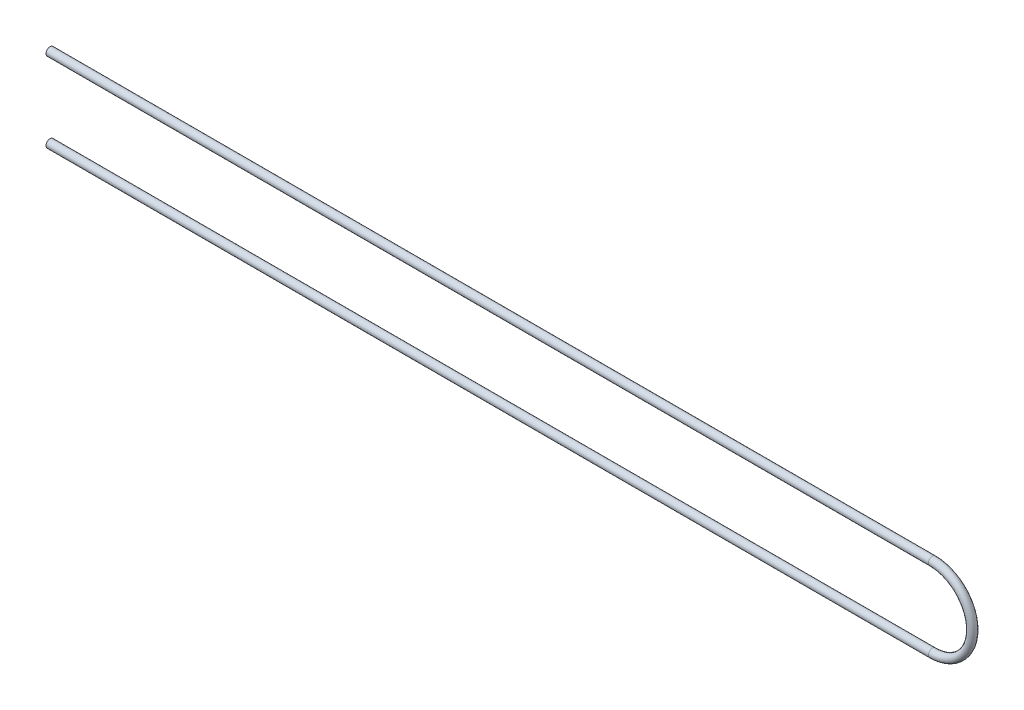
ISO-10303-21;
HEADER;
FILE_DESCRIPTION(('STEP AP214'),'2;1');
FILE_NAME('part.step','',(''),(''),'','','');
FILE_SCHEMA(('AUTOMOTIVE_DESIGN { 1 0 10303 214 1 1 1 1 }'));
ENDSEC;
DATA;
#1=APPLICATION_CONTEXT('core data for automotive mechanical design processes');
#2=APPLICATION_PROTOCOL_DEFINITION('international standard','automotive_design',2000,#1);
#3=PRODUCT_CONTEXT('',#1,'mechanical');
#4=PRODUCT('Part','Part','',(#3));
#5=PRODUCT_RELATED_PRODUCT_CATEGORY('part','',(#4));
#6=PRODUCT_DEFINITION_FORMATION('','',#4);
#7=PRODUCT_DEFINITION_CONTEXT('part definition',#1,'design');
#8=PRODUCT_DEFINITION('design','',#6,#7);
#9=PRODUCT_DEFINITION_SHAPE('','',#8);
#10=(LENGTH_UNIT() NAMED_UNIT(*) SI_UNIT(.MILLI.,.METRE.));
#11=(NAMED_UNIT(*) PLANE_ANGLE_UNIT() SI_UNIT($,.RADIAN.));
#12=(NAMED_UNIT(*) SI_UNIT($,.STERADIAN.) SOLID_ANGLE_UNIT());
#13=UNCERTAINTY_MEASURE_WITH_UNIT(LENGTH_MEASURE(1.E-05),#10,'distance_accuracy_value','');
#14=(GEOMETRIC_REPRESENTATION_CONTEXT(3) GLOBAL_UNCERTAINTY_ASSIGNED_CONTEXT((#13)) GLOBAL_UNIT_ASSIGNED_CONTEXT((#10,
#11,#12)) REPRESENTATION_CONTEXT('',''));
#15=CARTESIAN_POINT('',(0.,0.,0.));
#16=DIRECTION('',(0.,0.,1.));
#17=DIRECTION('',(1.,0.,0.));
#18=AXIS2_PLACEMENT_3D('',#15,#16,#17);
#19=CARTESIAN_POINT('',(0.,0.,0.));
#20=DIRECTION('',(-1.,0.,0.));
#21=DIRECTION('',(0.,-1.,0.));
#22=AXIS2_PLACEMENT_3D('',#19,#20,#21);
#23=PLANE('',#22);
#24=CARTESIAN_POINT('',(0.,0.,0.));
#25=DIRECTION('',(-1.,0.,0.));
#26=DIRECTION('',(0.,-1.,0.));
#27=AXIS2_PLACEMENT_3D('',#24,#25,#26);
#28=CIRCLE('',#27,10.15);
#29=CARTESIAN_POINT('',(0.,-10.15,0.));
#30=VERTEX_POINT('',#29);
#31=EDGE_CURVE('E72',#30,#30,#28,.T.);
#32=ORIENTED_EDGE('',*,*,#31,.F.);
#33=EDGE_LOOP('',(#32));
#34=FACE_BOUND('',#33,.T.);
#35=CARTESIAN_POINT('',(0.,0.,0.));
#36=DIRECTION('',(-1.,0.,0.));
#37=DIRECTION('',(0.,-1.,0.));
#38=AXIS2_PLACEMENT_3D('',#35,#36,#37);
#39=CIRCLE('',#38,10.65);
#40=CARTESIAN_POINT('',(0.,-10.65,0.));
#41=VERTEX_POINT('',#40);
#42=EDGE_CURVE('E63',#41,#41,#39,.T.);
#43=ORIENTED_EDGE('',*,*,#42,.T.);
#44=EDGE_LOOP('',(#43));
#45=FACE_BOUND('',#44,.T.);
#46=ADVANCED_FACE('F49',(#34,#45),#23,.T.);
#47=CARTESIAN_POINT('',(0.,-210.,0.));
#48=DIRECTION('',(1.,0.,0.));
#49=DIRECTION('',(0.,1.,0.));
#50=AXIS2_PLACEMENT_3D('',#47,#48,#49);
#51=PLANE('',#50);
#52=CARTESIAN_POINT('',(0.,-210.,0.));
#53=DIRECTION('',(1.,0.,0.));
#54=DIRECTION('',(0.,1.,0.));
#55=AXIS2_PLACEMENT_3D('',#52,#53,#54);
#56=CIRCLE('',#55,10.15);
#57=CARTESIAN_POINT('',(0.,-199.85,0.));
#58=VERTEX_POINT('',#57);
#59=EDGE_CURVE('E68',#58,#58,#56,.T.);
#60=ORIENTED_EDGE('',*,*,#59,.T.);
#61=EDGE_LOOP('',(#60));
#62=FACE_BOUND('',#61,.T.);
#63=CARTESIAN_POINT('',(0.,-210.,0.));
#64=DIRECTION('',(1.,0.,0.));
#65=DIRECTION('',(0.,1.,0.));
#66=AXIS2_PLACEMENT_3D('',#63,#64,#65);
#67=CIRCLE('',#66,10.65);
#68=CARTESIAN_POINT('',(0.,-199.35,0.));
#69=VERTEX_POINT('',#68);
#70=EDGE_CURVE('E11',#69,#69,#67,.T.);
#71=ORIENTED_EDGE('',*,*,#70,.F.);
#72=EDGE_LOOP('',(#71));
#73=FACE_BOUND('',#72,.T.);
#74=ADVANCED_FACE('F92',(#62,#73),#51,.F.);
#75=CARTESIAN_POINT('',(0.,0.,0.));
#76=DIRECTION('',(1.,0.,0.));
#77=DIRECTION('',(0.,0.,-1.));
#78=AXIS2_PLACEMENT_3D('',#75,#76,#77);
#79=CYLINDRICAL_SURFACE('',#78,10.65);
#80=CARTESIAN_POINT('',(2325.,0.,0.));
#81=DIRECTION('',(-1.,0.,0.));
#82=DIRECTION('',(0.,-1.,0.));
#83=AXIS2_PLACEMENT_3D('',#80,#81,#82);
#84=CIRCLE('',#83,10.65);
#85=CARTESIAN_POINT('',(2325.,10.65,0.));
#86=VERTEX_POINT('',#85);
#87=EDGE_CURVE('E59',#86,#86,#84,.T.);
#88=ORIENTED_EDGE('',*,*,#87,.T.);
#89=EDGE_LOOP('',(#88));
#90=FACE_BOUND('',#89,.T.);
#91=ORIENTED_EDGE('',*,*,#42,.F.);
#92=EDGE_LOOP('',(#91));
#93=FACE_BOUND('',#92,.T.);
#94=ADVANCED_FACE('F96',(#90,#93),#79,.T.);
#95=CARTESIAN_POINT('',(2325.,-105.,0.));
#96=DIRECTION('',(0.,0.,-1.));
#97=DIRECTION('',(-1.,0.,0.));
#98=AXIS2_PLACEMENT_3D('',#95,#96,#97);
#99=TOROIDAL_SURFACE('',#98,105.,10.65);
#100=CARTESIAN_POINT('',(2325.,-210.,0.));
#101=DIRECTION('',(1.,0.,0.));
#102=DIRECTION('',(0.,1.,0.));
#103=AXIS2_PLACEMENT_3D('',#100,#101,#102);
#104=CIRCLE('',#103,10.65);
#105=CARTESIAN_POINT('',(2325.,-220.65,0.));
#106=VERTEX_POINT('',#105);
#107=EDGE_CURVE('E55',#106,#106,#104,.T.);
#108=CARTESIAN_POINT('',(2325.,-105.,0.));
#109=DIRECTION('',(0.,0.,-1.));
#110=DIRECTION('',(-1.,0.,0.));
#111=AXIS2_PLACEMENT_3D('',#108,#109,#110);
#112=CIRCLE('',#111,115.65);
#113=EDGE_CURVE('',#86,#106,#112,.T.);
#114=ORIENTED_EDGE('',*,*,#87,.F.);
#115=ORIENTED_EDGE('',*,*,#107,.T.);
#116=ORIENTED_EDGE('',*,*,#113,.T.);
#117=ORIENTED_EDGE('',*,*,#113,.F.);
#118=EDGE_LOOP('',(#114,#116,#115,#117));
#119=FACE_BOUND('',#118,.T.);
#120=ADVANCED_FACE('F98',(#119),#99,.T.);
#121=CARTESIAN_POINT('',(2325.,-210.,0.));
#122=DIRECTION('',(-1.,0.,0.));
#123=DIRECTION('',(0.,-1.,0.));
#124=AXIS2_PLACEMENT_3D('',#121,#122,#123);
#125=CYLINDRICAL_SURFACE('',#124,10.65);
#126=ORIENTED_EDGE('',*,*,#70,.T.);
#127=EDGE_LOOP('',(#126));
#128=FACE_BOUND('',#127,.T.);
#129=ORIENTED_EDGE('',*,*,#107,.F.);
#130=EDGE_LOOP('',(#129));
#131=FACE_BOUND('',#130,.T.);
#132=ADVANCED_FACE('F86',(#128,#131),#125,.T.);
#133=CARTESIAN_POINT('',(0.,0.,0.));
#134=DIRECTION('',(1.,0.,0.));
#135=DIRECTION('',(0.,0.,-1.));
#136=AXIS2_PLACEMENT_3D('',#133,#134,#135);
#137=CYLINDRICAL_SURFACE('',#136,10.15);
#138=CARTESIAN_POINT('',(2325.,0.,0.));
#139=DIRECTION('',(1.,0.,0.));
#140=DIRECTION('',(0.,0.,-1.));
#141=AXIS2_PLACEMENT_3D('',#138,#139,#140);
#142=CIRCLE('',#141,10.15);
#143=CARTESIAN_POINT('',(2325.,10.15,0.));
#144=VERTEX_POINT('',#143);
#145=EDGE_CURVE('E75',#144,#144,#142,.F.);
#146=ORIENTED_EDGE('',*,*,#145,.F.);
#147=EDGE_LOOP('',(#146));
#148=FACE_BOUND('',#147,.T.);
#149=ORIENTED_EDGE('',*,*,#31,.T.);
#150=EDGE_LOOP('',(#149));
#151=FACE_BOUND('',#150,.T.);
#152=ADVANCED_FACE('F83',(#148,#151),#137,.F.);
#153=CARTESIAN_POINT('',(2325.,-105.,0.));
#154=DIRECTION('',(0.,0.,-1.));
#155=DIRECTION('',(-1.,0.,0.));
#156=AXIS2_PLACEMENT_3D('',#153,#154,#155);
#157=TOROIDAL_SURFACE('',#156,105.,10.15);
#158=CARTESIAN_POINT('',(2325.,-210.,0.));
#159=DIRECTION('',(1.,0.,0.));
#160=DIRECTION('',(0.,1.,0.));
#161=AXIS2_PLACEMENT_3D('',#158,#159,#160);
#162=CIRCLE('',#161,10.15);
#163=CARTESIAN_POINT('',(2325.,-220.15,0.));
#164=VERTEX_POINT('',#163);
#165=EDGE_CURVE('E71',#164,#164,#162,.T.);
#166=CARTESIAN_POINT('',(2325.,-105.,0.));
#167=DIRECTION('',(0.,0.,-1.));
#168=DIRECTION('',(-1.,0.,0.));
#169=AXIS2_PLACEMENT_3D('',#166,#167,#168);
#170=CIRCLE('',#169,115.15);
#171=EDGE_CURVE('',#144,#164,#170,.T.);
#172=ORIENTED_EDGE('',*,*,#145,.T.);
#173=ORIENTED_EDGE('',*,*,#165,.F.);
#174=ORIENTED_EDGE('',*,*,#171,.T.);
#175=ORIENTED_EDGE('',*,*,#171,.F.);
#176=EDGE_LOOP('',(#172,#174,#173,#175));
#177=FACE_BOUND('',#176,.T.);
#178=ADVANCED_FACE('F81',(#177),#157,.F.);
#179=CARTESIAN_POINT('',(2325.,-210.,0.));
#180=DIRECTION('',(-1.,0.,0.));
#181=DIRECTION('',(0.,-1.,0.));
#182=AXIS2_PLACEMENT_3D('',#179,#180,#181);
#183=CYLINDRICAL_SURFACE('',#182,10.15);
#184=ORIENTED_EDGE('',*,*,#59,.F.);
#185=EDGE_LOOP('',(#184));
#186=FACE_BOUND('',#185,.T.);
#187=ORIENTED_EDGE('',*,*,#165,.T.);
#188=EDGE_LOOP('',(#187));
#189=FACE_BOUND('',#188,.T.);
#190=ADVANCED_FACE('F93',(#186,#189),#183,.F.);
#191=CLOSED_SHELL('',(#46,#74,#94,#120,#132,#152,#178,#190));
#192=MANIFOLD_SOLID_BREP('B2',#191);
#193=ADVANCED_BREP_SHAPE_REPRESENTATION('',(#18,#192),#14);
#194=SHAPE_DEFINITION_REPRESENTATION(#9,#193);
ENDSEC;
END-ISO-10303-21;
